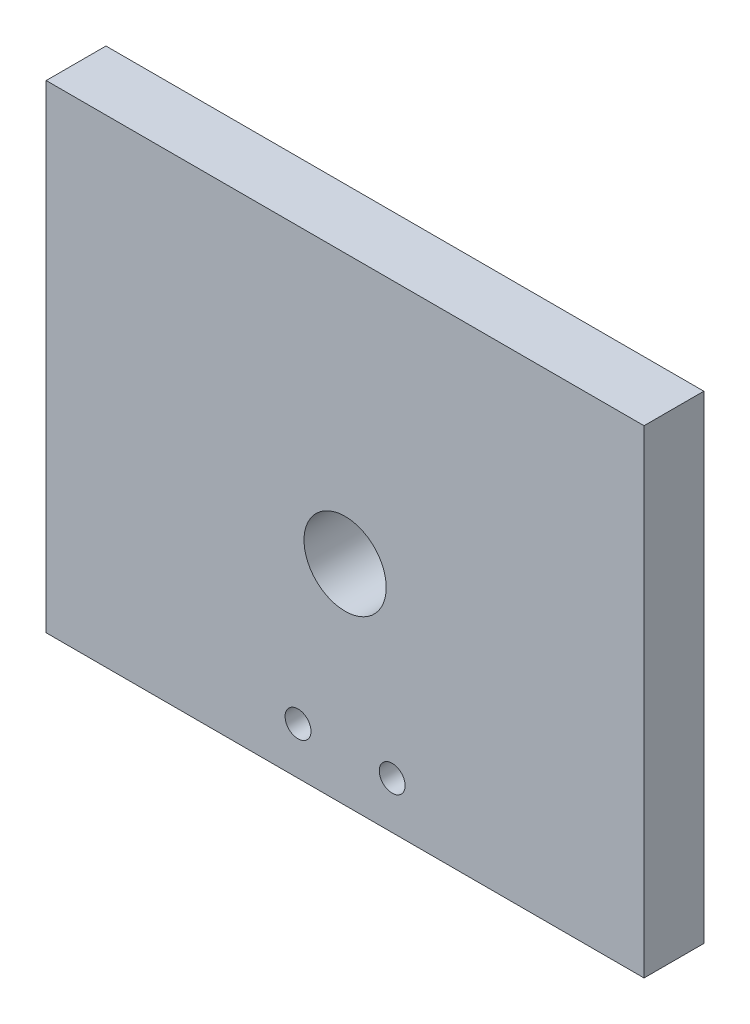
ISO-10303-21;
HEADER;
FILE_DESCRIPTION(('STEP AP214'),'2;1');
FILE_NAME('part.step','',(''),(''),'','','');
FILE_SCHEMA(('AUTOMOTIVE_DESIGN { 1 0 10303 214 1 1 1 1 }'));
ENDSEC;
DATA;
#1=APPLICATION_CONTEXT('core data for automotive mechanical design processes');
#2=APPLICATION_PROTOCOL_DEFINITION('international standard','automotive_design',2000,#1);
#3=PRODUCT_CONTEXT('',#1,'mechanical');
#4=PRODUCT('Part','Part','',(#3));
#5=PRODUCT_RELATED_PRODUCT_CATEGORY('part','',(#4));
#6=PRODUCT_DEFINITION_FORMATION('','',#4);
#7=PRODUCT_DEFINITION_CONTEXT('part definition',#1,'design');
#8=PRODUCT_DEFINITION('design','',#6,#7);
#9=PRODUCT_DEFINITION_SHAPE('','',#8);
#10=(LENGTH_UNIT() NAMED_UNIT(*) SI_UNIT(.MILLI.,.METRE.));
#11=(NAMED_UNIT(*) PLANE_ANGLE_UNIT() SI_UNIT($,.RADIAN.));
#12=(NAMED_UNIT(*) SI_UNIT($,.STERADIAN.) SOLID_ANGLE_UNIT());
#13=UNCERTAINTY_MEASURE_WITH_UNIT(LENGTH_MEASURE(1.E-05),#10,'distance_accuracy_value','');
#14=(GEOMETRIC_REPRESENTATION_CONTEXT(3) GLOBAL_UNCERTAINTY_ASSIGNED_CONTEXT((#13)) GLOBAL_UNIT_ASSIGNED_CONTEXT((#10,
#11,#12)) REPRESENTATION_CONTEXT('',''));
#15=CARTESIAN_POINT('',(0.,0.,0.));
#16=DIRECTION('',(0.,0.,1.));
#17=DIRECTION('',(1.,0.,0.));
#18=AXIS2_PLACEMENT_3D('',#15,#16,#17);
#19=CARTESIAN_POINT('',(63.5,50.8,6.35));
#20=DIRECTION('',(-1.,0.,0.));
#21=DIRECTION('',(0.,-1.,0.));
#22=AXIS2_PLACEMENT_3D('',#19,#20,#21);
#23=PLANE('',#22);
#24=DIRECTION('',(0.,1.,0.));
#25=VECTOR('',#24,1.);
#26=CARTESIAN_POINT('',(63.5,50.8,-6.35));
#27=LINE('',#26,#25);
#28=CARTESIAN_POINT('',(63.5,-50.8,-6.35));
#29=VERTEX_POINT('',#28);
#30=CARTESIAN_POINT('',(63.5,50.8,-6.35));
#31=VERTEX_POINT('',#30);
#32=EDGE_CURVE('E96',#29,#31,#27,.T.);
#33=ORIENTED_EDGE('',*,*,#32,.T.);
#34=DIRECTION('',(0.,0.,-1.));
#35=VECTOR('',#34,1.);
#36=CARTESIAN_POINT('',(63.5,50.8,6.35));
#37=LINE('',#36,#35);
#38=CARTESIAN_POINT('',(63.5,50.8,6.35));
#39=VERTEX_POINT('',#38);
#40=EDGE_CURVE('E11',#39,#31,#37,.T.);
#41=ORIENTED_EDGE('',*,*,#40,.F.);
#42=DIRECTION('',(0.,1.,0.));
#43=VECTOR('',#42,1.);
#44=CARTESIAN_POINT('',(63.5,50.8,6.35));
#45=LINE('',#44,#43);
#46=CARTESIAN_POINT('',(63.5,-50.8,6.35));
#47=VERTEX_POINT('',#46);
#48=EDGE_CURVE('E84',#47,#39,#45,.T.);
#49=ORIENTED_EDGE('',*,*,#48,.F.);
#50=DIRECTION('',(0.,0.,-1.));
#51=VECTOR('',#50,1.);
#52=CARTESIAN_POINT('',(63.5,-50.8,6.35));
#53=LINE('',#52,#51);
#54=EDGE_CURVE('E92',#47,#29,#53,.T.);
#55=ORIENTED_EDGE('',*,*,#54,.T.);
#56=EDGE_LOOP('',(#33,#41,#49,#55));
#57=FACE_BOUND('',#56,.T.);
#58=ADVANCED_FACE('F33',(#57),#23,.F.);
#59=CARTESIAN_POINT('',(-63.5,50.8,6.35));
#60=DIRECTION('',(0.,-1.,0.));
#61=DIRECTION('',(0.,0.,-1.));
#62=AXIS2_PLACEMENT_3D('',#59,#60,#61);
#63=PLANE('',#62);
#64=DIRECTION('',(-1.,0.,0.));
#65=VECTOR('',#64,1.);
#66=CARTESIAN_POINT('',(-63.5,50.8,-6.35));
#67=LINE('',#66,#65);
#68=CARTESIAN_POINT('',(-63.5,50.8,-6.35));
#69=VERTEX_POINT('',#68);
#70=EDGE_CURVE('E88',#31,#69,#67,.T.);
#71=ORIENTED_EDGE('',*,*,#70,.T.);
#72=DIRECTION('',(0.,0.,-1.));
#73=VECTOR('',#72,1.);
#74=CARTESIAN_POINT('',(-63.5,50.8,6.35));
#75=LINE('',#74,#73);
#76=CARTESIAN_POINT('',(-63.5,50.8,6.35));
#77=VERTEX_POINT('',#76);
#78=EDGE_CURVE('E41',#77,#69,#75,.T.);
#79=ORIENTED_EDGE('',*,*,#78,.F.);
#80=DIRECTION('',(-1.,0.,0.));
#81=VECTOR('',#80,1.);
#82=CARTESIAN_POINT('',(-63.5,50.8,6.35));
#83=LINE('',#82,#81);
#84=EDGE_CURVE('E79',#39,#77,#83,.T.);
#85=ORIENTED_EDGE('',*,*,#84,.F.);
#86=ORIENTED_EDGE('',*,*,#40,.T.);
#87=EDGE_LOOP('',(#71,#79,#85,#86));
#88=FACE_BOUND('',#87,.T.);
#89=ADVANCED_FACE('F87',(#88),#63,.F.);
#90=CARTESIAN_POINT('',(-63.5,50.8,6.35));
#91=DIRECTION('',(1.,0.,0.));
#92=DIRECTION('',(0.,1.,0.));
#93=AXIS2_PLACEMENT_3D('',#90,#91,#92);
#94=PLANE('',#93);
#95=DIRECTION('',(0.,-1.,0.));
#96=VECTOR('',#95,1.);
#97=CARTESIAN_POINT('',(-63.5,50.8,-6.35));
#98=LINE('',#97,#96);
#99=CARTESIAN_POINT('',(-63.5,-50.8,-6.35));
#100=VERTEX_POINT('',#99);
#101=EDGE_CURVE('E66',#69,#100,#98,.T.);
#102=ORIENTED_EDGE('',*,*,#101,.T.);
#103=DIRECTION('',(0.,0.,-1.));
#104=VECTOR('',#103,1.);
#105=CARTESIAN_POINT('',(-63.5,-50.8,6.35));
#106=LINE('',#105,#104);
#107=CARTESIAN_POINT('',(-63.5,-50.8,6.35));
#108=VERTEX_POINT('',#107);
#109=EDGE_CURVE('E89',#108,#100,#106,.T.);
#110=ORIENTED_EDGE('',*,*,#109,.F.);
#111=DIRECTION('',(0.,-1.,0.));
#112=VECTOR('',#111,1.);
#113=CARTESIAN_POINT('',(-63.5,50.8,6.35));
#114=LINE('',#113,#112);
#115=EDGE_CURVE('E82',#77,#108,#114,.T.);
#116=ORIENTED_EDGE('',*,*,#115,.F.);
#117=ORIENTED_EDGE('',*,*,#78,.T.);
#118=EDGE_LOOP('',(#102,#110,#116,#117));
#119=FACE_BOUND('',#118,.T.);
#120=ADVANCED_FACE('F90',(#119),#94,.F.);
#121=CARTESIAN_POINT('',(-63.5,-50.8,6.35));
#122=DIRECTION('',(0.,1.,0.));
#123=DIRECTION('',(0.,0.,1.));
#124=AXIS2_PLACEMENT_3D('',#121,#122,#123);
#125=PLANE('',#124);
#126=DIRECTION('',(1.,0.,0.));
#127=VECTOR('',#126,1.);
#128=CARTESIAN_POINT('',(-63.5,-50.8,-6.35));
#129=LINE('',#128,#127);
#130=EDGE_CURVE('E72',#100,#29,#129,.T.);
#131=ORIENTED_EDGE('',*,*,#130,.T.);
#132=ORIENTED_EDGE('',*,*,#54,.F.);
#133=DIRECTION('',(1.,0.,0.));
#134=VECTOR('',#133,1.);
#135=CARTESIAN_POINT('',(-63.5,-50.8,6.35));
#136=LINE('',#135,#134);
#137=EDGE_CURVE('E49',#108,#47,#136,.T.);
#138=ORIENTED_EDGE('',*,*,#137,.F.);
#139=ORIENTED_EDGE('',*,*,#109,.T.);
#140=EDGE_LOOP('',(#131,#132,#138,#139));
#141=FACE_BOUND('',#140,.T.);
#142=ADVANCED_FACE('F104',(#141),#125,.F.);
#143=CARTESIAN_POINT('',(0.,0.,6.35));
#144=DIRECTION('',(0.,0.,1.));
#145=DIRECTION('',(1.,0.,0.));
#146=AXIS2_PLACEMENT_3D('',#143,#144,#145);
#147=PLANE('',#146);
#148=CARTESIAN_POINT('',(-10.,-40.8,6.35));
#149=DIRECTION('',(0.,0.,1.));
#150=DIRECTION('',(1.,0.,0.));
#151=AXIS2_PLACEMENT_3D('',#148,#149,#150);
#152=CIRCLE('',#151,2.75);
#153=CARTESIAN_POINT('',(-7.25,-40.8,6.35));
#154=VERTEX_POINT('',#153);
#155=EDGE_CURVE('E124',#154,#154,#152,.T.);
#156=ORIENTED_EDGE('',*,*,#155,.F.);
#157=EDGE_LOOP('',(#156));
#158=FACE_BOUND('',#157,.T.);
#159=CARTESIAN_POINT('',(10.,-40.8,6.35));
#160=DIRECTION('',(0.,0.,1.));
#161=DIRECTION('',(1.,0.,0.));
#162=AXIS2_PLACEMENT_3D('',#159,#160,#161);
#163=CIRCLE('',#162,2.75);
#164=CARTESIAN_POINT('',(12.75,-40.8,6.35));
#165=VERTEX_POINT('',#164);
#166=EDGE_CURVE('E118',#165,#165,#163,.T.);
#167=ORIENTED_EDGE('',*,*,#166,.F.);
#168=EDGE_LOOP('',(#167));
#169=FACE_BOUND('',#168,.T.);
#170=CARTESIAN_POINT('',(0.,-6.34999999999999,6.35));
#171=DIRECTION('',(0.,0.,1.));
#172=DIRECTION('',(1.,0.,0.));
#173=AXIS2_PLACEMENT_3D('',#170,#171,#172);
#174=CIRCLE('',#173,8.73125000000001);
#175=CARTESIAN_POINT('',(8.73125000000001,-6.34999999999999,6.35));
#176=VERTEX_POINT('',#175);
#177=EDGE_CURVE('E112',#176,#176,#174,.T.);
#178=ORIENTED_EDGE('',*,*,#177,.F.);
#179=EDGE_LOOP('',(#178));
#180=FACE_BOUND('',#179,.T.);
#181=ORIENTED_EDGE('',*,*,#48,.T.);
#182=ORIENTED_EDGE('',*,*,#84,.T.);
#183=ORIENTED_EDGE('',*,*,#115,.T.);
#184=ORIENTED_EDGE('',*,*,#137,.T.);
#185=EDGE_LOOP('',(#181,#182,#183,#184));
#186=FACE_BOUND('',#185,.T.);
#187=ADVANCED_FACE('F80',(#158,#169,#180,#186),#147,.T.);
#188=CARTESIAN_POINT('',(0.,0.,-6.35));
#189=DIRECTION('',(0.,0.,1.));
#190=DIRECTION('',(1.,0.,0.));
#191=AXIS2_PLACEMENT_3D('',#188,#189,#190);
#192=PLANE('',#191);
#193=CARTESIAN_POINT('',(-10.,-40.8,-6.35));
#194=DIRECTION('',(0.,0.,1.));
#195=DIRECTION('',(1.,0.,0.));
#196=AXIS2_PLACEMENT_3D('',#193,#194,#195);
#197=CIRCLE('',#196,2.75);
#198=CARTESIAN_POINT('',(-7.25,-40.8,-6.35));
#199=VERTEX_POINT('',#198);
#200=EDGE_CURVE('E121',#199,#199,#197,.T.);
#201=ORIENTED_EDGE('',*,*,#200,.T.);
#202=EDGE_LOOP('',(#201));
#203=FACE_BOUND('',#202,.T.);
#204=CARTESIAN_POINT('',(10.,-40.8,-6.35));
#205=DIRECTION('',(0.,0.,1.));
#206=DIRECTION('',(1.,0.,0.));
#207=AXIS2_PLACEMENT_3D('',#204,#205,#206);
#208=CIRCLE('',#207,2.75);
#209=CARTESIAN_POINT('',(12.75,-40.8,-6.35));
#210=VERTEX_POINT('',#209);
#211=EDGE_CURVE('E115',#210,#210,#208,.T.);
#212=ORIENTED_EDGE('',*,*,#211,.T.);
#213=EDGE_LOOP('',(#212));
#214=FACE_BOUND('',#213,.T.);
#215=CARTESIAN_POINT('',(0.,-6.34999999999999,-6.35));
#216=DIRECTION('',(0.,0.,1.));
#217=DIRECTION('',(1.,0.,0.));
#218=AXIS2_PLACEMENT_3D('',#215,#216,#217);
#219=CIRCLE('',#218,8.73125000000001);
#220=CARTESIAN_POINT('',(8.73125000000001,-6.34999999999999,-6.35));
#221=VERTEX_POINT('',#220);
#222=EDGE_CURVE('E99',#221,#221,#219,.T.);
#223=ORIENTED_EDGE('',*,*,#222,.T.);
#224=EDGE_LOOP('',(#223));
#225=FACE_BOUND('',#224,.T.);
#226=ORIENTED_EDGE('',*,*,#32,.F.);
#227=ORIENTED_EDGE('',*,*,#130,.F.);
#228=ORIENTED_EDGE('',*,*,#101,.F.);
#229=ORIENTED_EDGE('',*,*,#70,.F.);
#230=EDGE_LOOP('',(#226,#227,#228,#229));
#231=FACE_BOUND('',#230,.T.);
#232=ADVANCED_FACE('F107',(#203,#214,#225,#231),#192,.F.);
#233=CARTESIAN_POINT('',(0.,-6.34999999999999,6.35));
#234=DIRECTION('',(0.,0.,1.));
#235=DIRECTION('',(1.,0.,0.));
#236=AXIS2_PLACEMENT_3D('',#233,#234,#235);
#237=CYLINDRICAL_SURFACE('',#236,8.73125000000001);
#238=ORIENTED_EDGE('',*,*,#222,.F.);
#239=EDGE_LOOP('',(#238));
#240=FACE_BOUND('',#239,.T.);
#241=ORIENTED_EDGE('',*,*,#177,.T.);
#242=EDGE_LOOP('',(#241));
#243=FACE_BOUND('',#242,.T.);
#244=ADVANCED_FACE('F137',(#240,#243),#237,.F.);
#245=CARTESIAN_POINT('',(10.,-40.8,6.35));
#246=DIRECTION('',(0.,0.,1.));
#247=DIRECTION('',(1.,0.,0.));
#248=AXIS2_PLACEMENT_3D('',#245,#246,#247);
#249=CYLINDRICAL_SURFACE('',#248,2.75);
#250=ORIENTED_EDGE('',*,*,#211,.F.);
#251=EDGE_LOOP('',(#250));
#252=FACE_BOUND('',#251,.T.);
#253=ORIENTED_EDGE('',*,*,#166,.T.);
#254=EDGE_LOOP('',(#253));
#255=FACE_BOUND('',#254,.T.);
#256=ADVANCED_FACE('F139',(#252,#255),#249,.F.);
#257=CARTESIAN_POINT('',(-10.,-40.8,6.35));
#258=DIRECTION('',(0.,0.,1.));
#259=DIRECTION('',(1.,0.,0.));
#260=AXIS2_PLACEMENT_3D('',#257,#258,#259);
#261=CYLINDRICAL_SURFACE('',#260,2.75);
#262=ORIENTED_EDGE('',*,*,#200,.F.);
#263=EDGE_LOOP('',(#262));
#264=FACE_BOUND('',#263,.T.);
#265=ORIENTED_EDGE('',*,*,#155,.T.);
#266=EDGE_LOOP('',(#265));
#267=FACE_BOUND('',#266,.T.);
#268=ADVANCED_FACE('F128',(#264,#267),#261,.F.);
#269=CLOSED_SHELL('',(#58,#89,#120,#142,#187,#232,#244,#256,#268));
#270=MANIFOLD_SOLID_BREP('B2',#269);
#271=ADVANCED_BREP_SHAPE_REPRESENTATION('',(#18,#270),#14);
#272=SHAPE_DEFINITION_REPRESENTATION(#9,#271);
ENDSEC;
END-ISO-10303-21;
